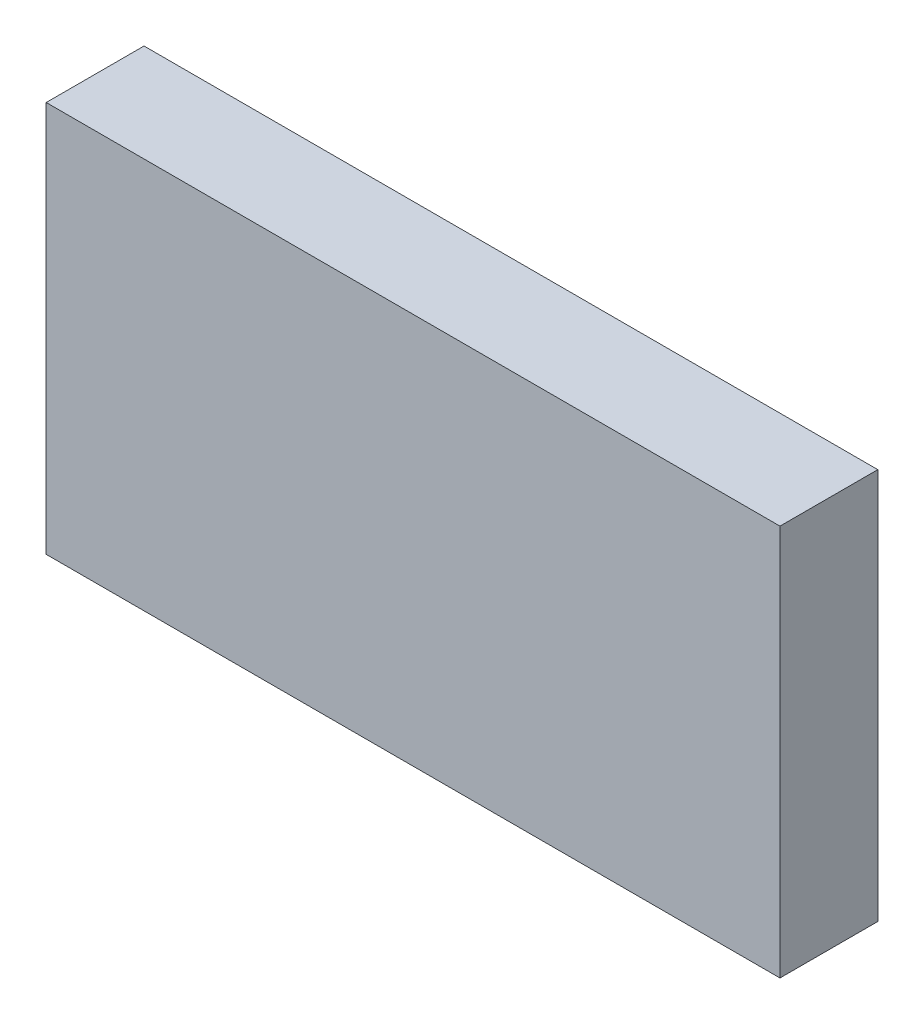
ISO-10303-21;
HEADER;
FILE_DESCRIPTION(('STEP AP214'),'2;1');
FILE_NAME('part.step','',(''),(''),'','','');
FILE_SCHEMA(('AUTOMOTIVE_DESIGN { 1 0 10303 214 1 1 1 1 }'));
ENDSEC;
DATA;
#1=APPLICATION_CONTEXT('core data for automotive mechanical design processes');
#2=APPLICATION_PROTOCOL_DEFINITION('international standard','automotive_design',2000,#1);
#3=PRODUCT_CONTEXT('',#1,'mechanical');
#4=PRODUCT('Part','Part','',(#3));
#5=PRODUCT_RELATED_PRODUCT_CATEGORY('part','',(#4));
#6=PRODUCT_DEFINITION_FORMATION('','',#4);
#7=PRODUCT_DEFINITION_CONTEXT('part definition',#1,'design');
#8=PRODUCT_DEFINITION('design','',#6,#7);
#9=PRODUCT_DEFINITION_SHAPE('','',#8);
#10=(LENGTH_UNIT() NAMED_UNIT(*) SI_UNIT(.MILLI.,.METRE.));
#11=(NAMED_UNIT(*) PLANE_ANGLE_UNIT() SI_UNIT($,.RADIAN.));
#12=(NAMED_UNIT(*) SI_UNIT($,.STERADIAN.) SOLID_ANGLE_UNIT());
#13=UNCERTAINTY_MEASURE_WITH_UNIT(LENGTH_MEASURE(1.E-05),#10,'distance_accuracy_value','');
#14=(GEOMETRIC_REPRESENTATION_CONTEXT(3) GLOBAL_UNCERTAINTY_ASSIGNED_CONTEXT((#13)) GLOBAL_UNIT_ASSIGNED_CONTEXT((#10,
#11,#12)) REPRESENTATION_CONTEXT('',''));
#15=CARTESIAN_POINT('',(0.,0.,0.));
#16=DIRECTION('',(0.,0.,1.));
#17=DIRECTION('',(1.,0.,0.));
#18=AXIS2_PLACEMENT_3D('',#15,#16,#17);
#19=CARTESIAN_POINT('',(0.,8.,2.));
#20=DIRECTION('',(1.,0.,0.));
#21=DIRECTION('',(0.,0.,-1.));
#22=AXIS2_PLACEMENT_3D('',#19,#20,#21);
#23=PLANE('',#22);
#24=DIRECTION('',(0.,-1.,0.));
#25=VECTOR('',#24,1.);
#26=CARTESIAN_POINT('',(0.,8.,0.));
#27=LINE('',#26,#25);
#28=CARTESIAN_POINT('',(0.,8.,0.));
#29=VERTEX_POINT('',#28);
#30=CARTESIAN_POINT('',(0.,0.,0.));
#31=VERTEX_POINT('',#30);
#32=EDGE_CURVE('E102',#29,#31,#27,.T.);
#33=ORIENTED_EDGE('',*,*,#32,.T.);
#34=DIRECTION('',(0.,0.,-1.));
#35=VECTOR('',#34,1.);
#36=CARTESIAN_POINT('',(0.,0.,2.));
#37=LINE('',#36,#35);
#38=CARTESIAN_POINT('',(0.,0.,2.));
#39=VERTEX_POINT('',#38);
#40=EDGE_CURVE('E11',#39,#31,#37,.T.);
#41=ORIENTED_EDGE('',*,*,#40,.F.);
#42=DIRECTION('',(0.,-1.,0.));
#43=VECTOR('',#42,1.);
#44=CARTESIAN_POINT('',(0.,8.,2.));
#45=LINE('',#44,#43);
#46=CARTESIAN_POINT('',(0.,8.,2.));
#47=VERTEX_POINT('',#46);
#48=EDGE_CURVE('E90',#47,#39,#45,.T.);
#49=ORIENTED_EDGE('',*,*,#48,.F.);
#50=DIRECTION('',(0.,0.,-1.));
#51=VECTOR('',#50,1.);
#52=CARTESIAN_POINT('',(0.,8.,2.));
#53=LINE('',#52,#51);
#54=EDGE_CURVE('E98',#47,#29,#53,.T.);
#55=ORIENTED_EDGE('',*,*,#54,.T.);
#56=EDGE_LOOP('',(#33,#41,#49,#55));
#57=FACE_BOUND('',#56,.T.);
#58=ADVANCED_FACE('F39',(#57),#23,.F.);
#59=CARTESIAN_POINT('',(0.,0.,2.));
#60=DIRECTION('',(0.,1.,0.));
#61=DIRECTION('',(0.,0.,1.));
#62=AXIS2_PLACEMENT_3D('',#59,#60,#61);
#63=PLANE('',#62);
#64=DIRECTION('',(1.,0.,0.));
#65=VECTOR('',#64,1.);
#66=CARTESIAN_POINT('',(0.,0.,0.));
#67=LINE('',#66,#65);
#68=CARTESIAN_POINT('',(15.,0.,0.));
#69=VERTEX_POINT('',#68);
#70=EDGE_CURVE('E94',#31,#69,#67,.T.);
#71=ORIENTED_EDGE('',*,*,#70,.T.);
#72=DIRECTION('',(0.,0.,-1.));
#73=VECTOR('',#72,1.);
#74=CARTESIAN_POINT('',(15.,0.,2.));
#75=LINE('',#74,#73);
#76=CARTESIAN_POINT('',(15.,0.,2.));
#77=VERTEX_POINT('',#76);
#78=EDGE_CURVE('E47',#77,#69,#75,.T.);
#79=ORIENTED_EDGE('',*,*,#78,.F.);
#80=DIRECTION('',(1.,0.,0.));
#81=VECTOR('',#80,1.);
#82=CARTESIAN_POINT('',(0.,0.,2.));
#83=LINE('',#82,#81);
#84=EDGE_CURVE('E85',#39,#77,#83,.T.);
#85=ORIENTED_EDGE('',*,*,#84,.F.);
#86=ORIENTED_EDGE('',*,*,#40,.T.);
#87=EDGE_LOOP('',(#71,#79,#85,#86));
#88=FACE_BOUND('',#87,.T.);
#89=ADVANCED_FACE('F93',(#88),#63,.F.);
#90=CARTESIAN_POINT('',(15.,0.,2.));
#91=DIRECTION('',(-1.,0.,0.));
#92=DIRECTION('',(0.,0.,1.));
#93=AXIS2_PLACEMENT_3D('',#90,#91,#92);
#94=PLANE('',#93);
#95=DIRECTION('',(0.,1.,0.));
#96=VECTOR('',#95,1.);
#97=CARTESIAN_POINT('',(15.,0.,0.));
#98=LINE('',#97,#96);
#99=CARTESIAN_POINT('',(15.,8.,0.));
#100=VERTEX_POINT('',#99);
#101=EDGE_CURVE('E72',#69,#100,#98,.T.);
#102=ORIENTED_EDGE('',*,*,#101,.T.);
#103=DIRECTION('',(0.,0.,-1.));
#104=VECTOR('',#103,1.);
#105=CARTESIAN_POINT('',(15.,8.,2.));
#106=LINE('',#105,#104);
#107=CARTESIAN_POINT('',(15.,8.,2.));
#108=VERTEX_POINT('',#107);
#109=EDGE_CURVE('E95',#108,#100,#106,.T.);
#110=ORIENTED_EDGE('',*,*,#109,.F.);
#111=DIRECTION('',(0.,1.,0.));
#112=VECTOR('',#111,1.);
#113=CARTESIAN_POINT('',(15.,0.,2.));
#114=LINE('',#113,#112);
#115=EDGE_CURVE('E88',#77,#108,#114,.T.);
#116=ORIENTED_EDGE('',*,*,#115,.F.);
#117=ORIENTED_EDGE('',*,*,#78,.T.);
#118=EDGE_LOOP('',(#102,#110,#116,#117));
#119=FACE_BOUND('',#118,.T.);
#120=ADVANCED_FACE('F96',(#119),#94,.F.);
#121=CARTESIAN_POINT('',(15.,8.,2.));
#122=DIRECTION('',(0.,-1.,0.));
#123=DIRECTION('',(0.,0.,-1.));
#124=AXIS2_PLACEMENT_3D('',#121,#122,#123);
#125=PLANE('',#124);
#126=DIRECTION('',(-1.,0.,0.));
#127=VECTOR('',#126,1.);
#128=CARTESIAN_POINT('',(15.,8.,0.));
#129=LINE('',#128,#127);
#130=EDGE_CURVE('E78',#100,#29,#129,.T.);
#131=ORIENTED_EDGE('',*,*,#130,.T.);
#132=ORIENTED_EDGE('',*,*,#54,.F.);
#133=DIRECTION('',(-1.,0.,0.));
#134=VECTOR('',#133,1.);
#135=CARTESIAN_POINT('',(15.,8.,2.));
#136=LINE('',#135,#134);
#137=EDGE_CURVE('E55',#108,#47,#136,.T.);
#138=ORIENTED_EDGE('',*,*,#137,.F.);
#139=ORIENTED_EDGE('',*,*,#109,.T.);
#140=EDGE_LOOP('',(#131,#132,#138,#139));
#141=FACE_BOUND('',#140,.T.);
#142=ADVANCED_FACE('F109',(#141),#125,.F.);
#143=CARTESIAN_POINT('',(0.,0.,2.));
#144=DIRECTION('',(0.,0.,1.));
#145=DIRECTION('',(1.,0.,0.));
#146=AXIS2_PLACEMENT_3D('',#143,#144,#145);
#147=PLANE('',#146);
#148=ORIENTED_EDGE('',*,*,#48,.T.);
#149=ORIENTED_EDGE('',*,*,#84,.T.);
#150=ORIENTED_EDGE('',*,*,#115,.T.);
#151=ORIENTED_EDGE('',*,*,#137,.T.);
#152=EDGE_LOOP('',(#148,#149,#150,#151));
#153=FACE_BOUND('',#152,.T.);
#154=ADVANCED_FACE('F86',(#153),#147,.T.);
#155=CARTESIAN_POINT('',(0.,0.,0.));
#156=DIRECTION('',(0.,0.,1.));
#157=DIRECTION('',(1.,0.,0.));
#158=AXIS2_PLACEMENT_3D('',#155,#156,#157);
#159=PLANE('',#158);
#160=ORIENTED_EDGE('',*,*,#32,.F.);
#161=ORIENTED_EDGE('',*,*,#130,.F.);
#162=ORIENTED_EDGE('',*,*,#101,.F.);
#163=ORIENTED_EDGE('',*,*,#70,.F.);
#164=EDGE_LOOP('',(#160,#161,#162,#163));
#165=FACE_BOUND('',#164,.T.);
#166=ADVANCED_FACE('F112',(#165),#159,.F.);
#167=CLOSED_SHELL('',(#58,#89,#120,#142,#154,#166));
#168=MANIFOLD_SOLID_BREP('B2',#167);
#169=ADVANCED_BREP_SHAPE_REPRESENTATION('',(#18,#168),#14);
#170=SHAPE_DEFINITION_REPRESENTATION(#9,#169);
ENDSEC;
END-ISO-10303-21;
